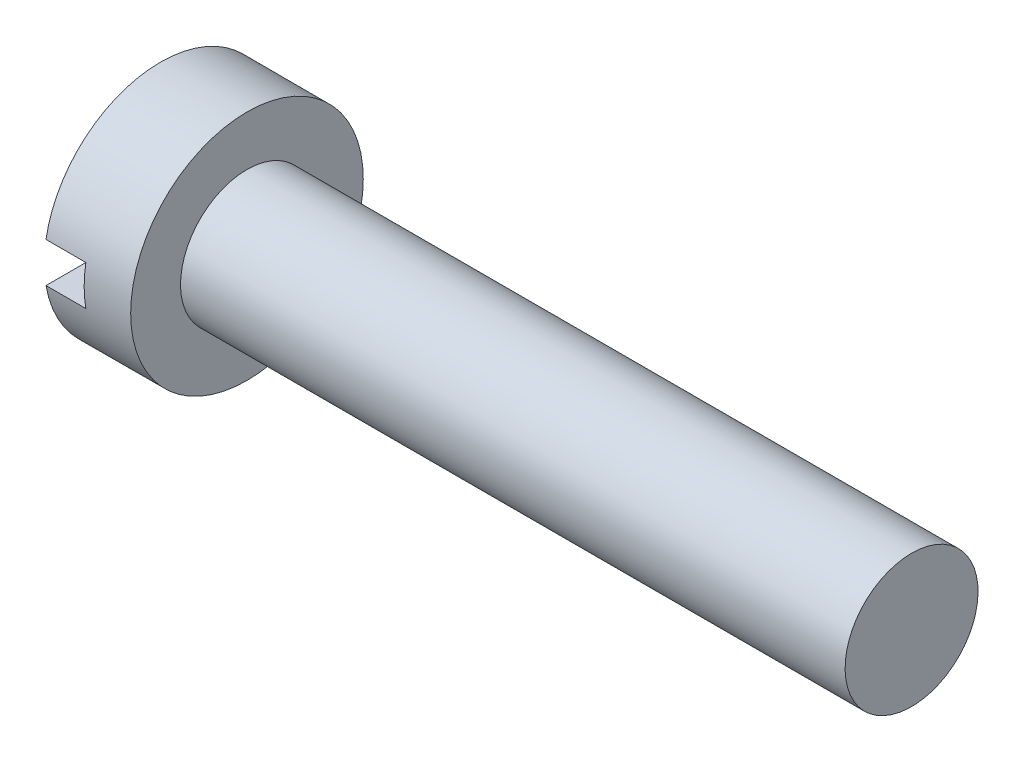
ISO-10303-21;
HEADER;
FILE_DESCRIPTION(('STEP AP214'),'2;1');
FILE_NAME('part.step','',(''),(''),'','','');
FILE_SCHEMA(('AUTOMOTIVE_DESIGN { 1 0 10303 214 1 1 1 1 }'));
ENDSEC;
DATA;
#1=APPLICATION_CONTEXT('core data for automotive mechanical design processes');
#2=APPLICATION_PROTOCOL_DEFINITION('international standard','automotive_design',2000,#1);
#3=PRODUCT_CONTEXT('',#1,'mechanical');
#4=PRODUCT('Part','Part','',(#3));
#5=PRODUCT_RELATED_PRODUCT_CATEGORY('part','',(#4));
#6=PRODUCT_DEFINITION_FORMATION('','',#4);
#7=PRODUCT_DEFINITION_CONTEXT('part definition',#1,'design');
#8=PRODUCT_DEFINITION('design','',#6,#7);
#9=PRODUCT_DEFINITION_SHAPE('','',#8);
#10=(LENGTH_UNIT() NAMED_UNIT(*) SI_UNIT(.MILLI.,.METRE.));
#11=(NAMED_UNIT(*) PLANE_ANGLE_UNIT() SI_UNIT($,.RADIAN.));
#12=(NAMED_UNIT(*) SI_UNIT($,.STERADIAN.) SOLID_ANGLE_UNIT());
#13=UNCERTAINTY_MEASURE_WITH_UNIT(LENGTH_MEASURE(1.E-05),#10,'distance_accuracy_value','');
#14=(GEOMETRIC_REPRESENTATION_CONTEXT(3) GLOBAL_UNCERTAINTY_ASSIGNED_CONTEXT((#13)) GLOBAL_UNIT_ASSIGNED_CONTEXT((#10,
#11,#12)) REPRESENTATION_CONTEXT('',''));
#15=CARTESIAN_POINT('',(0.,0.,0.));
#16=DIRECTION('',(0.,0.,1.));
#17=DIRECTION('',(1.,0.,0.));
#18=AXIS2_PLACEMENT_3D('',#15,#16,#17);
#19=CARTESIAN_POINT('',(0.,0.,0.));
#20=DIRECTION('',(-1.,0.,0.));
#21=DIRECTION('',(0.,-1.,0.));
#22=AXIS2_PLACEMENT_3D('',#19,#20,#21);
#23=PLANE('',#22);
#24=DIRECTION('',(0.,0.,-1.));
#25=VECTOR('',#24,1.);
#26=CARTESIAN_POINT('',(0.,0.599999999999996,-3.5));
#27=LINE('',#26,#25);
#28=CARTESIAN_POINT('',(0.,0.599999999999999,3.44818792991333));
#29=VERTEX_POINT('',#28);
#30=CARTESIAN_POINT('',(0.,0.599999999999996,-3.44818792991333));
#31=VERTEX_POINT('',#30);
#32=EDGE_CURVE('E83',#29,#31,#27,.T.);
#33=ORIENTED_EDGE('',*,*,#32,.F.);
#34=CARTESIAN_POINT('',(0.,0.,0.));
#35=DIRECTION('',(1.,0.,0.));
#36=DIRECTION('',(0.,1.,0.));
#37=AXIS2_PLACEMENT_3D('',#34,#35,#36);
#38=CIRCLE('',#37,3.5);
#39=EDGE_CURVE('E89',#31,#29,#38,.T.);
#40=ORIENTED_EDGE('',*,*,#39,.F.);
#41=EDGE_LOOP('',(#33,#40));
#42=FACE_BOUND('',#41,.T.);
#43=ADVANCED_FACE('F33',(#42),#23,.T.);
#44=DIRECTION('',(0.,0.,1.));
#45=VECTOR('',#44,1.);
#46=CARTESIAN_POINT('',(0.,-0.600000000000001,-3.5));
#47=LINE('',#46,#45);
#48=CARTESIAN_POINT('',(0.,-0.600000000000001,-3.44818792991333));
#49=VERTEX_POINT('',#48);
#50=CARTESIAN_POINT('',(0.,-0.599999999999999,3.44818792991333));
#51=VERTEX_POINT('',#50);
#52=EDGE_CURVE('E77',#49,#51,#47,.T.);
#53=ORIENTED_EDGE('',*,*,#52,.F.);
#54=EDGE_CURVE('E82',#51,#49,#38,.T.);
#55=ORIENTED_EDGE('',*,*,#54,.F.);
#56=EDGE_LOOP('',(#53,#55));
#57=FACE_BOUND('',#56,.T.);
#58=ADVANCED_FACE('F35',(#57),#23,.T.);
#59=CARTESIAN_POINT('',(22.6,0.,0.));
#60=DIRECTION('',(1.,0.,0.));
#61=DIRECTION('',(0.,1.,0.));
#62=AXIS2_PLACEMENT_3D('',#59,#60,#61);
#63=CYLINDRICAL_SURFACE('',#62,3.5);
#64=DIRECTION('',(1.,0.,0.));
#65=VECTOR('',#64,1.);
#66=CARTESIAN_POINT('',(22.6,0.599999999999996,-3.44818792991333));
#67=LINE('',#66,#65);
#68=CARTESIAN_POINT('',(1.2,0.599999999999996,-3.44818792991333));
#69=VERTEX_POINT('',#68);
#70=EDGE_CURVE('E11',#31,#69,#67,.T.);
#71=ORIENTED_EDGE('',*,*,#70,.F.);
#72=ORIENTED_EDGE('',*,*,#39,.T.);
#73=DIRECTION('',(1.,0.,0.));
#74=VECTOR('',#73,1.);
#75=CARTESIAN_POINT('',(22.6,0.599999999999999,3.44818792991333));
#76=LINE('',#75,#74);
#77=CARTESIAN_POINT('',(1.2,0.599999999999999,3.44818792991333));
#78=VERTEX_POINT('',#77);
#79=EDGE_CURVE('E98',#78,#29,#76,.F.);
#80=ORIENTED_EDGE('',*,*,#79,.F.);
#81=CARTESIAN_POINT('',(1.2,0.,0.));
#82=DIRECTION('',(-1.,0.,0.));
#83=DIRECTION('',(0.,0.,1.));
#84=AXIS2_PLACEMENT_3D('',#81,#82,#83);
#85=CIRCLE('',#84,3.5);
#86=CARTESIAN_POINT('',(1.2,-0.599999999999999,3.44818792991333));
#87=VERTEX_POINT('',#86);
#88=EDGE_CURVE('E48',#78,#87,#85,.F.);
#89=ORIENTED_EDGE('',*,*,#88,.T.);
#90=DIRECTION('',(1.,0.,0.));
#91=VECTOR('',#90,1.);
#92=CARTESIAN_POINT('',(22.6,-0.599999999999999,3.44818792991333));
#93=LINE('',#92,#91);
#94=EDGE_CURVE('E88',#51,#87,#93,.T.);
#95=ORIENTED_EDGE('',*,*,#94,.F.);
#96=ORIENTED_EDGE('',*,*,#54,.T.);
#97=DIRECTION('',(1.,0.,0.));
#98=VECTOR('',#97,1.);
#99=CARTESIAN_POINT('',(22.6,-0.600000000000001,-3.44818792991333));
#100=LINE('',#99,#98);
#101=CARTESIAN_POINT('',(1.2,-0.600000000000001,-3.44818792991333));
#102=VERTEX_POINT('',#101);
#103=EDGE_CURVE('E41',#102,#49,#100,.F.);
#104=ORIENTED_EDGE('',*,*,#103,.F.);
#105=EDGE_CURVE('E56',#102,#69,#85,.F.);
#106=ORIENTED_EDGE('',*,*,#105,.T.);
#107=EDGE_LOOP('',(#71,#72,#80,#89,#95,#96,#104,#106));
#108=FACE_BOUND('',#107,.T.);
#109=CARTESIAN_POINT('',(2.6,0.,0.));
#110=DIRECTION('',(1.,0.,0.));
#111=DIRECTION('',(0.,1.,0.));
#112=AXIS2_PLACEMENT_3D('',#109,#110,#111);
#113=CIRCLE('',#112,3.5);
#114=CARTESIAN_POINT('',(2.6,3.5,0.));
#115=VERTEX_POINT('',#114);
#116=EDGE_CURVE('E93',#115,#115,#113,.T.);
#117=ORIENTED_EDGE('',*,*,#116,.F.);
#118=EDGE_LOOP('',(#117));
#119=FACE_BOUND('',#118,.T.);
#120=ADVANCED_FACE('F86',(#108,#119),#63,.T.);
#121=CARTESIAN_POINT('',(2.6,3.5,0.));
#122=DIRECTION('',(1.,0.,0.));
#123=DIRECTION('',(0.,1.,0.));
#124=AXIS2_PLACEMENT_3D('',#121,#122,#123);
#125=PLANE('',#124);
#126=ORIENTED_EDGE('',*,*,#116,.T.);
#127=EDGE_LOOP('',(#126));
#128=FACE_BOUND('',#127,.T.);
#129=CARTESIAN_POINT('',(2.6,0.,0.));
#130=DIRECTION('',(1.,0.,0.));
#131=DIRECTION('',(0.,1.,0.));
#132=AXIS2_PLACEMENT_3D('',#129,#130,#131);
#133=CIRCLE('',#132,2.);
#134=CARTESIAN_POINT('',(2.6,2.,0.));
#135=VERTEX_POINT('',#134);
#136=EDGE_CURVE('E111',#135,#135,#133,.T.);
#137=ORIENTED_EDGE('',*,*,#136,.F.);
#138=EDGE_LOOP('',(#137));
#139=FACE_BOUND('',#138,.T.);
#140=ADVANCED_FACE('F118',(#128,#139),#125,.T.);
#141=CARTESIAN_POINT('',(22.6,0.,0.));
#142=DIRECTION('',(1.,0.,0.));
#143=DIRECTION('',(0.,1.,0.));
#144=AXIS2_PLACEMENT_3D('',#141,#142,#143);
#145=CYLINDRICAL_SURFACE('',#144,2.);
#146=ORIENTED_EDGE('',*,*,#136,.T.);
#147=EDGE_LOOP('',(#146));
#148=FACE_BOUND('',#147,.T.);
#149=CARTESIAN_POINT('',(22.6,0.,0.));
#150=DIRECTION('',(1.,0.,0.));
#151=DIRECTION('',(0.,1.,0.));
#152=AXIS2_PLACEMENT_3D('',#149,#150,#151);
#153=CIRCLE('',#152,1.99999999999999);
#154=CARTESIAN_POINT('',(22.6,2.,0.));
#155=VERTEX_POINT('',#154);
#156=EDGE_CURVE('E109',#155,#155,#153,.T.);
#157=ORIENTED_EDGE('',*,*,#156,.F.);
#158=EDGE_LOOP('',(#157));
#159=FACE_BOUND('',#158,.T.);
#160=ADVANCED_FACE('F125',(#148,#159),#145,.T.);
#161=CARTESIAN_POINT('',(22.6,2.,0.));
#162=DIRECTION('',(1.,0.,0.));
#163=DIRECTION('',(0.,1.,0.));
#164=AXIS2_PLACEMENT_3D('',#161,#162,#163);
#165=PLANE('',#164);
#166=ORIENTED_EDGE('',*,*,#156,.T.);
#167=EDGE_LOOP('',(#166));
#168=FACE_BOUND('',#167,.T.);
#169=ADVANCED_FACE('F150',(#168),#165,.T.);
#170=CARTESIAN_POINT('',(1.2,0.599999999999996,-3.5));
#171=DIRECTION('',(0.,1.,0.));
#172=DIRECTION('',(0.,0.,1.));
#173=AXIS2_PLACEMENT_3D('',#170,#171,#172);
#174=PLANE('',#173);
#175=ORIENTED_EDGE('',*,*,#79,.T.);
#176=ORIENTED_EDGE('',*,*,#32,.T.);
#177=ORIENTED_EDGE('',*,*,#70,.T.);
#178=DIRECTION('',(0.,0.,-1.));
#179=VECTOR('',#178,1.);
#180=CARTESIAN_POINT('',(1.2,0.599999999999996,-3.5));
#181=LINE('',#180,#179);
#182=EDGE_CURVE('E105',#78,#69,#181,.T.);
#183=ORIENTED_EDGE('',*,*,#182,.F.);
#184=EDGE_LOOP('',(#175,#176,#177,#183));
#185=FACE_BOUND('',#184,.T.);
#186=ADVANCED_FACE('F145',(#185),#174,.F.);
#187=CARTESIAN_POINT('',(1.2,-0.600000000000001,-3.5));
#188=DIRECTION('',(0.,-1.,0.));
#189=DIRECTION('',(0.,0.,-1.));
#190=AXIS2_PLACEMENT_3D('',#187,#188,#189);
#191=PLANE('',#190);
#192=ORIENTED_EDGE('',*,*,#103,.T.);
#193=ORIENTED_EDGE('',*,*,#52,.T.);
#194=ORIENTED_EDGE('',*,*,#94,.T.);
#195=DIRECTION('',(0.,0.,1.));
#196=VECTOR('',#195,1.);
#197=CARTESIAN_POINT('',(1.2,-0.600000000000001,-3.5));
#198=LINE('',#197,#196);
#199=EDGE_CURVE('E78',#102,#87,#198,.T.);
#200=ORIENTED_EDGE('',*,*,#199,.F.);
#201=EDGE_LOOP('',(#192,#193,#194,#200));
#202=FACE_BOUND('',#201,.T.);
#203=ADVANCED_FACE('F76',(#202),#191,.F.);
#204=CARTESIAN_POINT('',(1.2,0.,0.));
#205=DIRECTION('',(-1.,0.,0.));
#206=DIRECTION('',(0.,0.,1.));
#207=AXIS2_PLACEMENT_3D('',#204,#205,#206);
#208=PLANE('',#207);
#209=ORIENTED_EDGE('',*,*,#199,.T.);
#210=ORIENTED_EDGE('',*,*,#88,.F.);
#211=ORIENTED_EDGE('',*,*,#182,.T.);
#212=ORIENTED_EDGE('',*,*,#105,.F.);
#213=EDGE_LOOP('',(#209,#210,#211,#212));
#214=FACE_BOUND('',#213,.T.);
#215=ADVANCED_FACE('F160',(#214),#208,.T.);
#216=CLOSED_SHELL('',(#43,#58,#120,#140,#160,#169,#186,#203,#215));
#217=MANIFOLD_SOLID_BREP('B2',#216);
#218=ADVANCED_BREP_SHAPE_REPRESENTATION('',(#18,#217),#14);
#219=SHAPE_DEFINITION_REPRESENTATION(#9,#218);
ENDSEC;
END-ISO-10303-21;
